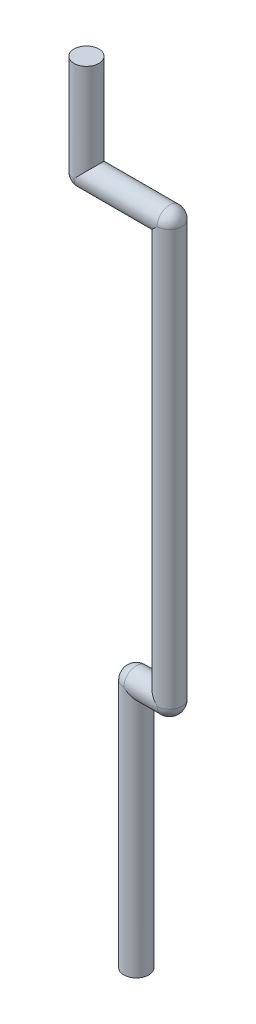
ISO-10303-21;
HEADER;
FILE_DESCRIPTION(('STEP AP214'),'2;1');
FILE_NAME('part.step','',(''),(''),'','','');
FILE_SCHEMA(('AUTOMOTIVE_DESIGN { 1 0 10303 214 1 1 1 1 }'));
ENDSEC;
DATA;
#1=APPLICATION_CONTEXT('core data for automotive mechanical design processes');
#2=APPLICATION_PROTOCOL_DEFINITION('international standard','automotive_design',2000,#1);
#3=PRODUCT_CONTEXT('',#1,'mechanical');
#4=PRODUCT('Part','Part','',(#3));
#5=PRODUCT_RELATED_PRODUCT_CATEGORY('part','',(#4));
#6=PRODUCT_DEFINITION_FORMATION('','',#4);
#7=PRODUCT_DEFINITION_CONTEXT('part definition',#1,'design');
#8=PRODUCT_DEFINITION('design','',#6,#7);
#9=PRODUCT_DEFINITION_SHAPE('','',#8);
#10=(LENGTH_UNIT() NAMED_UNIT(*) SI_UNIT(.MILLI.,.METRE.));
#11=(NAMED_UNIT(*) PLANE_ANGLE_UNIT() SI_UNIT($,.RADIAN.));
#12=(NAMED_UNIT(*) SI_UNIT($,.STERADIAN.) SOLID_ANGLE_UNIT());
#13=UNCERTAINTY_MEASURE_WITH_UNIT(LENGTH_MEASURE(1.E-05),#10,'distance_accuracy_value','');
#14=(GEOMETRIC_REPRESENTATION_CONTEXT(3) GLOBAL_UNCERTAINTY_ASSIGNED_CONTEXT((#13)) GLOBAL_UNIT_ASSIGNED_CONTEXT((#10,
#11,#12)) REPRESENTATION_CONTEXT('',''));
#15=CARTESIAN_POINT('',(0.,0.,0.));
#16=DIRECTION('',(0.,0.,1.));
#17=DIRECTION('',(1.,0.,0.));
#18=AXIS2_PLACEMENT_3D('',#15,#16,#17);
#19=CARTESIAN_POINT('',(-3.,40.,0.));
#20=DIRECTION('',(1.,0.,0.));
#21=DIRECTION('',(0.,0.,-1.));
#22=AXIS2_PLACEMENT_3D('',#19,#20,#21);
#23=CYLINDRICAL_SURFACE('',#22,0.75);
#24=CARTESIAN_POINT('',(2.,40.,0.));
#25=DIRECTION('',(0.707106781186547,-0.707106781186547,0.));
#26=DIRECTION('',(-0.707106781186547,-0.707106781186547,0.));
#27=AXIS2_PLACEMENT_3D('',#24,#25,#26);
#28=ELLIPSE('',#27,1.06066017177982,0.75);
#29=CARTESIAN_POINT('',(2.,40.,0.75));
#30=VERTEX_POINT('',#29);
#31=CARTESIAN_POINT('',(2.,40.,-0.75));
#32=VERTEX_POINT('',#31);
#33=EDGE_CURVE('E53',#30,#32,#28,.T.);
#34=ORIENTED_EDGE('',*,*,#33,.F.);
#35=CARTESIAN_POINT('',(2.,40.,0.));
#36=DIRECTION('',(1.,0.,0.));
#37=DIRECTION('',(0.,0.,-1.));
#38=AXIS2_PLACEMENT_3D('',#35,#36,#37);
#39=CIRCLE('',#38,0.75);
#40=EDGE_CURVE('E75',#32,#30,#39,.T.);
#41=ORIENTED_EDGE('',*,*,#40,.F.);
#42=EDGE_LOOP('',(#34,#41));
#43=FACE_BOUND('',#42,.T.);
#44=CARTESIAN_POINT('',(-3.,40.,0.));
#45=DIRECTION('',(1.,0.,0.));
#46=DIRECTION('',(0.,0.,-1.));
#47=AXIS2_PLACEMENT_3D('',#44,#45,#46);
#48=CIRCLE('',#47,0.75);
#49=CARTESIAN_POINT('',(-3.,40.,-0.75));
#50=VERTEX_POINT('',#49);
#51=CARTESIAN_POINT('',(-3.,40.,0.75));
#52=VERTEX_POINT('',#51);
#53=EDGE_CURVE('E70',#50,#52,#48,.F.);
#54=ORIENTED_EDGE('',*,*,#53,.F.);
#55=CARTESIAN_POINT('',(-3.,40.,0.));
#56=DIRECTION('',(0.707106781186547,-0.707106781186547,0.));
#57=DIRECTION('',(0.707106781186547,0.707106781186547,0.));
#58=AXIS2_PLACEMENT_3D('',#55,#56,#57);
#59=ELLIPSE('',#58,1.06066017177982,0.75);
#60=EDGE_CURVE('E76',#50,#52,#59,.T.);
#61=ORIENTED_EDGE('',*,*,#60,.T.);
#62=EDGE_LOOP('',(#54,#61));
#63=FACE_BOUND('',#62,.T.);
#64=ADVANCED_FACE('F34',(#43,#63),#23,.T.);
#65=CARTESIAN_POINT('',(-3.,40.,0.));
#66=DIRECTION('',(0.,0.,-1.));
#67=DIRECTION('',(0.,1.,0.));
#68=AXIS2_PLACEMENT_3D('',#65,#66,#67);
#69=SPHERICAL_SURFACE('',#68,0.75);
#70=CARTESIAN_POINT('',(-3.,40.,0.));
#71=DIRECTION('',(0.,1.,0.));
#72=DIRECTION('',(0.,0.,1.));
#73=AXIS2_PLACEMENT_3D('',#70,#71,#72);
#74=CIRCLE('',#73,0.75);
#75=EDGE_CURVE('E11',#50,#52,#74,.T.);
#76=ORIENTED_EDGE('',*,*,#75,.F.);
#77=ORIENTED_EDGE('',*,*,#53,.T.);
#78=EDGE_LOOP('',(#76,#77));
#79=FACE_BOUND('',#78,.T.);
#80=ADVANCED_FACE('F72',(#79),#69,.T.);
#81=CARTESIAN_POINT('',(2.,15.,0.));
#82=DIRECTION('',(-1.,0.,0.));
#83=DIRECTION('',(0.,0.,1.));
#84=AXIS2_PLACEMENT_3D('',#81,#82,#83);
#85=CYLINDRICAL_SURFACE('',#84,0.75);
#86=CARTESIAN_POINT('',(0.,15.,0.));
#87=DIRECTION('',(1.,0.,0.));
#88=DIRECTION('',(0.,0.,-1.));
#89=AXIS2_PLACEMENT_3D('',#86,#87,#88);
#90=CIRCLE('',#89,0.75);
#91=CARTESIAN_POINT('',(0.,15.,-0.75));
#92=VERTEX_POINT('',#91);
#93=CARTESIAN_POINT('',(0.,15.,0.75));
#94=VERTEX_POINT('',#93);
#95=EDGE_CURVE('E103',#92,#94,#90,.T.);
#96=ORIENTED_EDGE('',*,*,#95,.T.);
#97=CARTESIAN_POINT('',(0.,15.,0.));
#98=DIRECTION('',(-0.707106781186547,-0.707106781186547,0.));
#99=DIRECTION('',(0.707106781186547,-0.707106781186547,0.));
#100=AXIS2_PLACEMENT_3D('',#97,#98,#99);
#101=ELLIPSE('',#100,1.06066017177982,0.75);
#102=EDGE_CURVE('E106',#94,#92,#101,.F.);
#103=ORIENTED_EDGE('',*,*,#102,.T.);
#104=EDGE_LOOP('',(#96,#103));
#105=FACE_BOUND('',#104,.T.);
#106=CARTESIAN_POINT('',(2.,15.,0.));
#107=DIRECTION('',(-0.707106781186547,-0.707106781186547,0.));
#108=DIRECTION('',(-0.707106781186547,0.707106781186547,0.));
#109=AXIS2_PLACEMENT_3D('',#106,#107,#108);
#110=ELLIPSE('',#109,1.06066017177982,0.75);
#111=CARTESIAN_POINT('',(2.,15.,-0.75));
#112=VERTEX_POINT('',#111);
#113=CARTESIAN_POINT('',(2.,15.,0.75));
#114=VERTEX_POINT('',#113);
#115=EDGE_CURVE('E98',#112,#114,#110,.F.);
#116=ORIENTED_EDGE('',*,*,#115,.F.);
#117=CARTESIAN_POINT('',(2.,15.,0.));
#118=DIRECTION('',(1.,0.,0.));
#119=DIRECTION('',(0.,0.,-1.));
#120=AXIS2_PLACEMENT_3D('',#117,#118,#119);
#121=CIRCLE('',#120,0.75);
#122=EDGE_CURVE('E104',#114,#112,#121,.T.);
#123=ORIENTED_EDGE('',*,*,#122,.F.);
#124=EDGE_LOOP('',(#116,#123));
#125=FACE_BOUND('',#124,.T.);
#126=ADVANCED_FACE('F134',(#105,#125),#85,.T.);
#127=CARTESIAN_POINT('',(2.,15.,0.));
#128=DIRECTION('',(0.,1.,0.));
#129=DIRECTION('',(0.,0.,1.));
#130=AXIS2_PLACEMENT_3D('',#127,#128,#129);
#131=SPHERICAL_SURFACE('',#130,0.750000000000001);
#132=CARTESIAN_POINT('',(2.,15.,0.));
#133=DIRECTION('',(0.,1.,0.));
#134=DIRECTION('',(0.,0.,1.));
#135=AXIS2_PLACEMENT_3D('',#132,#133,#134);
#136=CIRCLE('',#135,0.75);
#137=EDGE_CURVE('E94',#114,#112,#136,.T.);
#138=ORIENTED_EDGE('',*,*,#137,.F.);
#139=ORIENTED_EDGE('',*,*,#122,.T.);
#140=EDGE_LOOP('',(#138,#139));
#141=FACE_BOUND('',#140,.T.);
#142=ADVANCED_FACE('F140',(#141),#131,.T.);
#143=CARTESIAN_POINT('',(0.,15.,0.));
#144=DIRECTION('',(0.,-1.,0.));
#145=DIRECTION('',(0.,0.,-1.));
#146=AXIS2_PLACEMENT_3D('',#143,#144,#145);
#147=CYLINDRICAL_SURFACE('',#146,0.75);
#148=CARTESIAN_POINT('',(0.,0.,0.));
#149=DIRECTION('',(0.,1.,0.));
#150=DIRECTION('',(0.,0.,1.));
#151=AXIS2_PLACEMENT_3D('',#148,#149,#150);
#152=CIRCLE('',#151,0.75);
#153=CARTESIAN_POINT('',(0.,0.,0.75));
#154=VERTEX_POINT('',#153);
#155=EDGE_CURVE('E111',#154,#154,#152,.T.);
#156=ORIENTED_EDGE('',*,*,#155,.T.);
#157=EDGE_LOOP('',(#156));
#158=FACE_BOUND('',#157,.T.);
#159=ORIENTED_EDGE('',*,*,#102,.F.);
#160=CARTESIAN_POINT('',(0.,15.,0.));
#161=DIRECTION('',(0.,1.,0.));
#162=DIRECTION('',(0.,0.,1.));
#163=AXIS2_PLACEMENT_3D('',#160,#161,#162);
#164=CIRCLE('',#163,0.75);
#165=EDGE_CURVE('E42',#92,#94,#164,.T.);
#166=ORIENTED_EDGE('',*,*,#165,.F.);
#167=EDGE_LOOP('',(#159,#166));
#168=FACE_BOUND('',#167,.T.);
#169=ADVANCED_FACE('F36',(#158,#168),#147,.T.);
#170=CARTESIAN_POINT('',(0.,15.,0.));
#171=DIRECTION('',(0.,1.,0.));
#172=DIRECTION('',(1.,0.,0.));
#173=AXIS2_PLACEMENT_3D('',#170,#171,#172);
#174=SPHERICAL_SURFACE('',#173,0.750000000000001);
#175=ORIENTED_EDGE('',*,*,#95,.F.);
#176=ORIENTED_EDGE('',*,*,#165,.T.);
#177=EDGE_LOOP('',(#175,#176));
#178=FACE_BOUND('',#177,.T.);
#179=ADVANCED_FACE('F120',(#178),#174,.T.);
#180=CARTESIAN_POINT('',(0.,0.,0.));
#181=DIRECTION('',(0.,1.,0.));
#182=DIRECTION('',(0.,0.,1.));
#183=AXIS2_PLACEMENT_3D('',#180,#181,#182);
#184=PLANE('',#183);
#185=ORIENTED_EDGE('',*,*,#155,.F.);
#186=EDGE_LOOP('',(#185));
#187=FACE_BOUND('',#186,.T.);
#188=ADVANCED_FACE('F117',(#187),#184,.F.);
#189=CARTESIAN_POINT('',(2.,40.,0.));
#190=DIRECTION('',(0.,-1.,0.));
#191=DIRECTION('',(0.,0.,-1.));
#192=AXIS2_PLACEMENT_3D('',#189,#190,#191);
#193=CYLINDRICAL_SURFACE('',#192,0.75);
#194=CARTESIAN_POINT('',(2.,40.,0.));
#195=DIRECTION('',(0.,1.,0.));
#196=DIRECTION('',(0.,0.,1.));
#197=AXIS2_PLACEMENT_3D('',#194,#195,#196);
#198=CIRCLE('',#197,0.75);
#199=EDGE_CURVE('E95',#30,#32,#198,.T.);
#200=ORIENTED_EDGE('',*,*,#199,.F.);
#201=ORIENTED_EDGE('',*,*,#33,.T.);
#202=EDGE_LOOP('',(#200,#201));
#203=FACE_BOUND('',#202,.T.);
#204=ORIENTED_EDGE('',*,*,#137,.T.);
#205=ORIENTED_EDGE('',*,*,#115,.T.);
#206=EDGE_LOOP('',(#204,#205));
#207=FACE_BOUND('',#206,.T.);
#208=ADVANCED_FACE('F119',(#203,#207),#193,.T.);
#209=CARTESIAN_POINT('',(2.,40.,0.));
#210=DIRECTION('',(0.,0.,-1.));
#211=DIRECTION('',(1.,0.,0.));
#212=AXIS2_PLACEMENT_3D('',#209,#210,#211);
#213=SPHERICAL_SURFACE('',#212,0.75);
#214=ORIENTED_EDGE('',*,*,#199,.T.);
#215=ORIENTED_EDGE('',*,*,#40,.T.);
#216=EDGE_LOOP('',(#214,#215));
#217=FACE_BOUND('',#216,.T.);
#218=ADVANCED_FACE('F85',(#217),#213,.T.);
#219=CARTESIAN_POINT('',(-3.,46.,0.));
#220=DIRECTION('',(0.,-1.,0.));
#221=DIRECTION('',(0.,0.,-1.));
#222=AXIS2_PLACEMENT_3D('',#219,#220,#221);
#223=CYLINDRICAL_SURFACE('',#222,0.75);
#224=ORIENTED_EDGE('',*,*,#60,.F.);
#225=ORIENTED_EDGE('',*,*,#75,.T.);
#226=EDGE_LOOP('',(#224,#225));
#227=FACE_BOUND('',#226,.T.);
#228=CARTESIAN_POINT('',(-3.,46.,0.));
#229=DIRECTION('',(0.,1.,0.));
#230=DIRECTION('',(0.,0.,1.));
#231=AXIS2_PLACEMENT_3D('',#228,#229,#230);
#232=CIRCLE('',#231,0.75);
#233=CARTESIAN_POINT('',(-3.,46.,0.75));
#234=VERTEX_POINT('',#233);
#235=EDGE_CURVE('E79',#234,#234,#232,.T.);
#236=ORIENTED_EDGE('',*,*,#235,.F.);
#237=EDGE_LOOP('',(#236));
#238=FACE_BOUND('',#237,.T.);
#239=ADVANCED_FACE('F81',(#227,#238),#223,.T.);
#240=CARTESIAN_POINT('',(-3.,46.,0.));
#241=DIRECTION('',(0.,1.,0.));
#242=DIRECTION('',(0.,0.,1.));
#243=AXIS2_PLACEMENT_3D('',#240,#241,#242);
#244=PLANE('',#243);
#245=ORIENTED_EDGE('',*,*,#235,.T.);
#246=EDGE_LOOP('',(#245));
#247=FACE_BOUND('',#246,.T.);
#248=ADVANCED_FACE('F84',(#247),#244,.T.);
#249=CLOSED_SHELL('',(#64,#80,#126,#142,#169,#179,#188,#208,#218,#239,#248));
#250=MANIFOLD_SOLID_BREP('B2',#249);
#251=ADVANCED_BREP_SHAPE_REPRESENTATION('',(#18,#250),#14);
#252=SHAPE_DEFINITION_REPRESENTATION(#9,#251);
ENDSEC;
END-ISO-10303-21;
